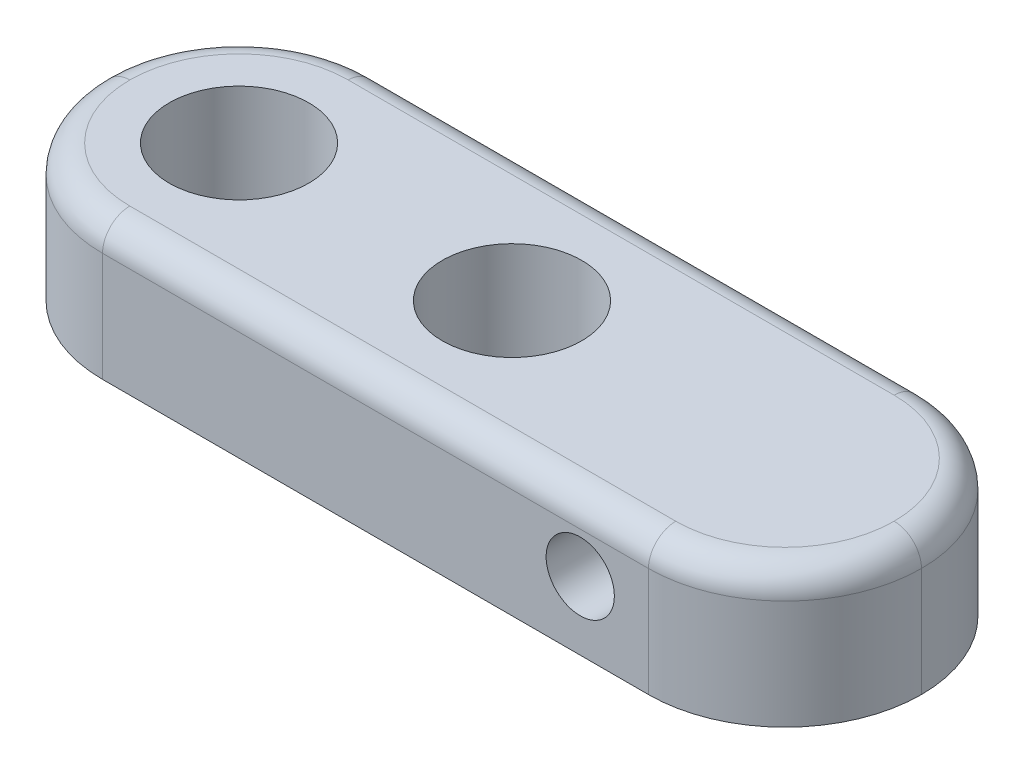
ISO-10303-21;
HEADER;
FILE_DESCRIPTION(('STEP AP214'),'2;1');
FILE_NAME('part.step','',(''),(''),'','','');
FILE_SCHEMA(('AUTOMOTIVE_DESIGN { 1 0 10303 214 1 1 1 1 }'));
ENDSEC;
DATA;
#1=APPLICATION_CONTEXT('core data for automotive mechanical design processes');
#2=APPLICATION_PROTOCOL_DEFINITION('international standard','automotive_design',2000,#1);
#3=PRODUCT_CONTEXT('',#1,'mechanical');
#4=PRODUCT('Part','Part','',(#3));
#5=PRODUCT_RELATED_PRODUCT_CATEGORY('part','',(#4));
#6=PRODUCT_DEFINITION_FORMATION('','',#4);
#7=PRODUCT_DEFINITION_CONTEXT('part definition',#1,'design');
#8=PRODUCT_DEFINITION('design','',#6,#7);
#9=PRODUCT_DEFINITION_SHAPE('','',#8);
#10=(LENGTH_UNIT() NAMED_UNIT(*) SI_UNIT(.MILLI.,.METRE.));
#11=(NAMED_UNIT(*) PLANE_ANGLE_UNIT() SI_UNIT($,.RADIAN.));
#12=(NAMED_UNIT(*) SI_UNIT($,.STERADIAN.) SOLID_ANGLE_UNIT());
#13=UNCERTAINTY_MEASURE_WITH_UNIT(LENGTH_MEASURE(1.E-05),#10,'distance_accuracy_value','');
#14=(GEOMETRIC_REPRESENTATION_CONTEXT(3) GLOBAL_UNCERTAINTY_ASSIGNED_CONTEXT((#13)) GLOBAL_UNIT_ASSIGNED_CONTEXT((#10,
#11,#12)) REPRESENTATION_CONTEXT('',''));
#15=CARTESIAN_POINT('',(0.,0.,0.));
#16=DIRECTION('',(0.,0.,1.));
#17=DIRECTION('',(1.,0.,0.));
#18=AXIS2_PLACEMENT_3D('',#15,#16,#17);
#19=CARTESIAN_POINT('',(-5.,5.,-5.));
#20=DIRECTION('',(0.,0.,1.));
#21=DIRECTION('',(1.,0.,0.));
#22=AXIS2_PLACEMENT_3D('',#19,#20,#21);
#23=PLANE('',#22);
#24=DIRECTION('',(0.,-1.,0.));
#25=VECTOR('',#24,1.);
#26=CARTESIAN_POINT('',(0.,5.,-5.));
#27=LINE('',#26,#25);
#28=CARTESIAN_POINT('',(0.,0.,-5.));
#29=VERTEX_POINT('',#28);
#30=CARTESIAN_POINT('',(0.,4.,-5.));
#31=VERTEX_POINT('',#30);
#32=EDGE_CURVE('E241',#29,#31,#27,.F.);
#33=ORIENTED_EDGE('',*,*,#32,.T.);
#34=DIRECTION('',(-1.,0.,0.));
#35=VECTOR('',#34,1.);
#36=CARTESIAN_POINT('',(20.,4.,-5.));
#37=LINE('',#36,#35);
#38=CARTESIAN_POINT('',(16.1160254037844,4.,-5.));
#39=VERTEX_POINT('',#38);
#40=EDGE_CURVE('E288',#31,#39,#37,.F.);
#41=ORIENTED_EDGE('',*,*,#40,.T.);
#42=DIRECTION('',(-0.5,-0.866025403784439,0.));
#43=VECTOR('',#42,1.);
#44=CARTESIAN_POINT('',(11.2700317547306,-4.39350721331743,-5.));
#45=LINE('',#44,#43);
#46=CARTESIAN_POINT('',(15.25,2.5,-5.));
#47=VERTEX_POINT('',#46);
#48=EDGE_CURVE('E368',#39,#47,#45,.T.);
#49=ORIENTED_EDGE('',*,*,#48,.T.);
#50=DIRECTION('',(0.5,-0.866025403784439,0.));
#51=VECTOR('',#50,1.);
#52=CARTESIAN_POINT('',(9.10496824526946,13.1435072133174,-5.));
#53=LINE('',#52,#51);
#54=CARTESIAN_POINT('',(16.375,0.551442841485011,-5.));
#55=VERTEX_POINT('',#54);
#56=EDGE_CURVE('E373',#47,#55,#53,.T.);
#57=ORIENTED_EDGE('',*,*,#56,.T.);
#58=DIRECTION('',(1.,0.,0.));
#59=VECTOR('',#58,1.);
#60=CARTESIAN_POINT('',(-5.,0.551442841485011,-5.));
#61=LINE('',#60,#59);
#62=CARTESIAN_POINT('',(18.625,0.551442841485013,-5.));
#63=VERTEX_POINT('',#62);
#64=EDGE_CURVE('E378',#55,#63,#61,.T.);
#65=ORIENTED_EDGE('',*,*,#64,.T.);
#66=DIRECTION('',(0.5,0.866025403784439,0.));
#67=VECTOR('',#66,1.);
#68=CARTESIAN_POINT('',(14.6450317547306,-6.34206437183243,-5.));
#69=LINE('',#68,#67);
#70=CARTESIAN_POINT('',(19.75,2.5,-5.));
#71=VERTEX_POINT('',#70);
#72=EDGE_CURVE('E184',#63,#71,#69,.T.);
#73=ORIENTED_EDGE('',*,*,#72,.T.);
#74=DIRECTION('',(-0.500000000000002,0.866025403784438,0.));
#75=VECTOR('',#74,1.);
#76=CARTESIAN_POINT('',(12.4799682452694,15.0920643718324,-5.));
#77=LINE('',#76,#75);
#78=CARTESIAN_POINT('',(18.8839745962156,4.,-5.));
#79=VERTEX_POINT('',#78);
#80=EDGE_CURVE('E374',#71,#79,#77,.T.);
#81=ORIENTED_EDGE('',*,*,#80,.T.);
#82=DIRECTION('',(-1.,0.,0.));
#83=VECTOR('',#82,1.);
#84=CARTESIAN_POINT('',(20.,4.,-5.));
#85=LINE('',#84,#83);
#86=CARTESIAN_POINT('',(20.,4.,-5.));
#87=VERTEX_POINT('',#86);
#88=EDGE_CURVE('E285',#79,#87,#85,.F.);
#89=ORIENTED_EDGE('',*,*,#88,.T.);
#90=DIRECTION('',(0.,-1.,0.));
#91=VECTOR('',#90,1.);
#92=CARTESIAN_POINT('',(20.,5.,-5.));
#93=LINE('',#92,#91);
#94=CARTESIAN_POINT('',(20.,0.,-5.));
#95=VERTEX_POINT('',#94);
#96=EDGE_CURVE('E238',#87,#95,#93,.T.);
#97=ORIENTED_EDGE('',*,*,#96,.T.);
#98=DIRECTION('',(-1.,0.,0.));
#99=VECTOR('',#98,1.);
#100=CARTESIAN_POINT('',(-5.,0.,-5.));
#101=LINE('',#100,#99);
#102=EDGE_CURVE('E221',#95,#29,#101,.T.);
#103=ORIENTED_EDGE('',*,*,#102,.T.);
#104=EDGE_LOOP('',(#33,#41,#49,#57,#65,#73,#81,#89,#97,#103));
#105=FACE_BOUND('',#104,.T.);
#106=ADVANCED_FACE('F45',(#105),#23,.F.);
#107=CARTESIAN_POINT('',(0.,5.,0.));
#108=DIRECTION('',(0.,1.,0.));
#109=DIRECTION('',(0.,0.,1.));
#110=AXIS2_PLACEMENT_3D('',#107,#108,#109);
#111=PLANE('',#110);
#112=CARTESIAN_POINT('',(0.,5.,0.));
#113=DIRECTION('',(0.,1.,0.));
#114=DIRECTION('',(0.,0.,1.));
#115=AXIS2_PLACEMENT_3D('',#112,#113,#114);
#116=CIRCLE('',#115,4.);
#117=CARTESIAN_POINT('',(0.,5.,-4.));
#118=VERTEX_POINT('',#117);
#119=CARTESIAN_POINT('',(-4.,5.,0.));
#120=VERTEX_POINT('',#119);
#121=EDGE_CURVE('E271',#118,#120,#116,.T.);
#122=ORIENTED_EDGE('',*,*,#121,.T.);
#123=CARTESIAN_POINT('',(0.,5.,0.));
#124=DIRECTION('',(0.,1.,0.));
#125=DIRECTION('',(0.,0.,1.));
#126=AXIS2_PLACEMENT_3D('',#123,#124,#125);
#127=CIRCLE('',#126,4.);
#128=CARTESIAN_POINT('',(0.,5.,4.));
#129=VERTEX_POINT('',#128);
#130=EDGE_CURVE('E274',#120,#129,#127,.T.);
#131=ORIENTED_EDGE('',*,*,#130,.T.);
#132=DIRECTION('',(1.,0.,0.));
#133=VECTOR('',#132,1.);
#134=CARTESIAN_POINT('',(20.,5.,4.));
#135=LINE('',#134,#133);
#136=CARTESIAN_POINT('',(20.,5.,4.));
#137=VERTEX_POINT('',#136);
#138=EDGE_CURVE('E251',#129,#137,#135,.T.);
#139=ORIENTED_EDGE('',*,*,#138,.T.);
#140=CARTESIAN_POINT('',(20.,5.,0.));
#141=DIRECTION('',(0.,1.,0.));
#142=DIRECTION('',(0.,0.,1.));
#143=AXIS2_PLACEMENT_3D('',#140,#141,#142);
#144=CIRCLE('',#143,4.);
#145=CARTESIAN_POINT('',(24.,5.,0.));
#146=VERTEX_POINT('',#145);
#147=EDGE_CURVE('E262',#137,#146,#144,.T.);
#148=ORIENTED_EDGE('',*,*,#147,.T.);
#149=CARTESIAN_POINT('',(20.,5.,0.));
#150=DIRECTION('',(0.,1.,0.));
#151=DIRECTION('',(0.,0.,1.));
#152=AXIS2_PLACEMENT_3D('',#149,#150,#151);
#153=CIRCLE('',#152,4.);
#154=CARTESIAN_POINT('',(20.,5.,-4.));
#155=VERTEX_POINT('',#154);
#156=EDGE_CURVE('E265',#146,#155,#153,.T.);
#157=ORIENTED_EDGE('',*,*,#156,.T.);
#158=DIRECTION('',(-1.,0.,0.));
#159=VECTOR('',#158,1.);
#160=CARTESIAN_POINT('',(0.,5.,-4.));
#161=LINE('',#160,#159);
#162=EDGE_CURVE('E268',#155,#118,#161,.T.);
#163=ORIENTED_EDGE('',*,*,#162,.T.);
#164=EDGE_LOOP('',(#122,#131,#139,#148,#157,#163));
#165=FACE_BOUND('',#164,.T.);
#166=CARTESIAN_POINT('',(0.,5.,0.));
#167=DIRECTION('',(0.,1.,0.));
#168=DIRECTION('',(0.,0.,1.));
#169=AXIS2_PLACEMENT_3D('',#166,#167,#168);
#170=CIRCLE('',#169,2.555);
#171=CARTESIAN_POINT('',(0.,5.,2.555));
#172=VERTEX_POINT('',#171);
#173=EDGE_CURVE('E210',#172,#172,#170,.T.);
#174=ORIENTED_EDGE('',*,*,#173,.F.);
#175=EDGE_LOOP('',(#174));
#176=FACE_BOUND('',#175,.T.);
#177=CARTESIAN_POINT('',(10.,5.,0.));
#178=DIRECTION('',(0.,1.,0.));
#179=DIRECTION('',(0.,0.,1.));
#180=AXIS2_PLACEMENT_3D('',#177,#178,#179);
#181=CIRCLE('',#180,2.555);
#182=CARTESIAN_POINT('',(10.,5.,2.555));
#183=VERTEX_POINT('',#182);
#184=EDGE_CURVE('E202',#183,#183,#181,.T.);
#185=ORIENTED_EDGE('',*,*,#184,.F.);
#186=EDGE_LOOP('',(#185));
#187=FACE_BOUND('',#186,.T.);
#188=ADVANCED_FACE('F432',(#165,#176,#187),#111,.T.);
#189=CARTESIAN_POINT('',(0.,0.,0.));
#190=DIRECTION('',(0.,1.,0.));
#191=DIRECTION('',(0.,0.,1.));
#192=AXIS2_PLACEMENT_3D('',#189,#190,#191);
#193=PLANE('',#192);
#194=CARTESIAN_POINT('',(0.,0.,0.));
#195=DIRECTION('',(0.,1.,0.));
#196=DIRECTION('',(0.,0.,1.));
#197=AXIS2_PLACEMENT_3D('',#194,#195,#196);
#198=CIRCLE('',#197,5.);
#199=CARTESIAN_POINT('',(0.,0.,5.));
#200=VERTEX_POINT('',#199);
#201=CARTESIAN_POINT('',(-5.,0.,0.));
#202=VERTEX_POINT('',#201);
#203=EDGE_CURVE('E232',#200,#202,#198,.F.);
#204=ORIENTED_EDGE('',*,*,#203,.T.);
#205=CARTESIAN_POINT('',(0.,0.,0.));
#206=DIRECTION('',(0.,1.,0.));
#207=DIRECTION('',(0.,0.,1.));
#208=AXIS2_PLACEMENT_3D('',#205,#206,#207);
#209=CIRCLE('',#208,5.);
#210=EDGE_CURVE('E235',#202,#29,#209,.F.);
#211=ORIENTED_EDGE('',*,*,#210,.T.);
#212=ORIENTED_EDGE('',*,*,#102,.F.);
#213=CARTESIAN_POINT('',(20.,0.,0.));
#214=DIRECTION('',(0.,1.,0.));
#215=DIRECTION('',(0.,0.,1.));
#216=AXIS2_PLACEMENT_3D('',#213,#214,#215);
#217=CIRCLE('',#216,5.);
#218=CARTESIAN_POINT('',(25.,0.,0.));
#219=VERTEX_POINT('',#218);
#220=EDGE_CURVE('E228',#95,#219,#217,.F.);
#221=ORIENTED_EDGE('',*,*,#220,.T.);
#222=CARTESIAN_POINT('',(20.,0.,0.));
#223=DIRECTION('',(0.,1.,0.));
#224=DIRECTION('',(0.,0.,1.));
#225=AXIS2_PLACEMENT_3D('',#222,#223,#224);
#226=CIRCLE('',#225,5.);
#227=CARTESIAN_POINT('',(20.,0.,5.));
#228=VERTEX_POINT('',#227);
#229=EDGE_CURVE('E225',#219,#228,#226,.F.);
#230=ORIENTED_EDGE('',*,*,#229,.T.);
#231=DIRECTION('',(1.,0.,0.));
#232=VECTOR('',#231,1.);
#233=CARTESIAN_POINT('',(-5.,0.,5.));
#234=LINE('',#233,#232);
#235=EDGE_CURVE('E214',#200,#228,#234,.T.);
#236=ORIENTED_EDGE('',*,*,#235,.F.);
#237=EDGE_LOOP('',(#204,#211,#212,#221,#230,#236));
#238=FACE_BOUND('',#237,.T.);
#239=CARTESIAN_POINT('',(0.,0.,0.));
#240=DIRECTION('',(0.,1.,0.));
#241=DIRECTION('',(0.,0.,1.));
#242=AXIS2_PLACEMENT_3D('',#239,#240,#241);
#243=CIRCLE('',#242,2.555);
#244=CARTESIAN_POINT('',(0.,0.,2.555));
#245=VERTEX_POINT('',#244);
#246=EDGE_CURVE('E206',#245,#245,#243,.T.);
#247=ORIENTED_EDGE('',*,*,#246,.T.);
#248=EDGE_LOOP('',(#247));
#249=FACE_BOUND('',#248,.T.);
#250=CARTESIAN_POINT('',(10.,0.,0.));
#251=DIRECTION('',(0.,1.,0.));
#252=DIRECTION('',(0.,0.,1.));
#253=AXIS2_PLACEMENT_3D('',#250,#251,#252);
#254=CIRCLE('',#253,2.555);
#255=CARTESIAN_POINT('',(10.,0.,2.555));
#256=VERTEX_POINT('',#255);
#257=EDGE_CURVE('E196',#256,#256,#254,.T.);
#258=ORIENTED_EDGE('',*,*,#257,.T.);
#259=EDGE_LOOP('',(#258));
#260=FACE_BOUND('',#259,.T.);
#261=ADVANCED_FACE('F422',(#238,#249,#260),#193,.F.);
#262=CARTESIAN_POINT('',(-5.,5.,5.));
#263=DIRECTION('',(0.,0.,-1.));
#264=DIRECTION('',(-1.,0.,0.));
#265=AXIS2_PLACEMENT_3D('',#262,#263,#264);
#266=PLANE('',#265);
#267=CARTESIAN_POINT('',(17.5,2.5,5.));
#268=DIRECTION('',(0.,0.,1.));
#269=DIRECTION('',(1.,0.,0.));
#270=AXIS2_PLACEMENT_3D('',#267,#268,#269);
#271=CIRCLE('',#270,1.25);
#272=CARTESIAN_POINT('',(18.75,2.5,5.));
#273=VERTEX_POINT('',#272);
#274=EDGE_CURVE('E190',#273,#273,#271,.T.);
#275=ORIENTED_EDGE('',*,*,#274,.F.);
#276=EDGE_LOOP('',(#275));
#277=FACE_BOUND('',#276,.T.);
#278=DIRECTION('',(0.,-1.,0.));
#279=VECTOR('',#278,1.);
#280=CARTESIAN_POINT('',(20.,5.,5.));
#281=LINE('',#280,#279);
#282=CARTESIAN_POINT('',(20.,4.,5.));
#283=VERTEX_POINT('',#282);
#284=EDGE_CURVE('E245',#228,#283,#281,.F.);
#285=ORIENTED_EDGE('',*,*,#284,.T.);
#286=DIRECTION('',(1.,0.,0.));
#287=VECTOR('',#286,1.);
#288=CARTESIAN_POINT('',(0.,4.,5.));
#289=LINE('',#288,#287);
#290=CARTESIAN_POINT('',(0.,4.,5.));
#291=VERTEX_POINT('',#290);
#292=EDGE_CURVE('E11',#283,#291,#289,.F.);
#293=ORIENTED_EDGE('',*,*,#292,.T.);
#294=DIRECTION('',(0.,-1.,0.));
#295=VECTOR('',#294,1.);
#296=CARTESIAN_POINT('',(0.,5.,5.));
#297=LINE('',#296,#295);
#298=EDGE_CURVE('E248',#291,#200,#297,.T.);
#299=ORIENTED_EDGE('',*,*,#298,.T.);
#300=ORIENTED_EDGE('',*,*,#235,.T.);
#301=EDGE_LOOP('',(#285,#293,#299,#300));
#302=FACE_BOUND('',#301,.T.);
#303=ADVANCED_FACE('F342',(#277,#302),#266,.F.);
#304=CARTESIAN_POINT('',(0.,5.,0.));
#305=DIRECTION('',(0.,-1.,0.));
#306=DIRECTION('',(0.,0.,-1.));
#307=AXIS2_PLACEMENT_3D('',#304,#305,#306);
#308=CYLINDRICAL_SURFACE('',#307,2.555);
#309=ORIENTED_EDGE('',*,*,#173,.T.);
#310=EDGE_LOOP('',(#309));
#311=FACE_BOUND('',#310,.T.);
#312=ORIENTED_EDGE('',*,*,#246,.F.);
#313=EDGE_LOOP('',(#312));
#314=FACE_BOUND('',#313,.T.);
#315=ADVANCED_FACE('F421',(#311,#314),#308,.F.);
#316=CARTESIAN_POINT('',(10.,5.,0.));
#317=DIRECTION('',(0.,-1.,0.));
#318=DIRECTION('',(0.,0.,-1.));
#319=AXIS2_PLACEMENT_3D('',#316,#317,#318);
#320=CYLINDRICAL_SURFACE('',#319,2.555);
#321=ORIENTED_EDGE('',*,*,#184,.T.);
#322=EDGE_LOOP('',(#321));
#323=FACE_BOUND('',#322,.T.);
#324=ORIENTED_EDGE('',*,*,#257,.F.);
#325=EDGE_LOOP('',(#324));
#326=FACE_BOUND('',#325,.T.);
#327=ADVANCED_FACE('F416',(#323,#326),#320,.F.);
#328=CARTESIAN_POINT('',(17.5,2.5,-5.));
#329=DIRECTION('',(0.,0.,1.));
#330=DIRECTION('',(1.,0.,0.));
#331=AXIS2_PLACEMENT_3D('',#328,#329,#330);
#332=CYLINDRICAL_SURFACE('',#331,1.25);
#333=CARTESIAN_POINT('',(17.5,2.5,0.));
#334=DIRECTION('',(0.,0.,1.));
#335=DIRECTION('',(1.,0.,0.));
#336=AXIS2_PLACEMENT_3D('',#333,#334,#335);
#337=CIRCLE('',#336,1.25);
#338=CARTESIAN_POINT('',(18.75,2.5,0.));
#339=VERTEX_POINT('',#338);
#340=EDGE_CURVE('E256',#339,#339,#337,.T.);
#341=ORIENTED_EDGE('',*,*,#340,.F.);
#342=EDGE_LOOP('',(#341));
#343=FACE_BOUND('',#342,.T.);
#344=ORIENTED_EDGE('',*,*,#274,.T.);
#345=EDGE_LOOP('',(#344));
#346=FACE_BOUND('',#345,.T.);
#347=ADVANCED_FACE('F413',(#343,#346),#332,.F.);
#348=CARTESIAN_POINT('',(0.,0.,0.));
#349=DIRECTION('',(0.,0.,1.));
#350=DIRECTION('',(1.,0.,0.));
#351=AXIS2_PLACEMENT_3D('',#348,#349,#350);
#352=PLANE('',#351);
#353=DIRECTION('',(-0.500000000000002,0.866025403784438,0.));
#354=VECTOR('',#353,1.);
#355=CARTESIAN_POINT('',(12.4799682452694,15.0920643718324,0.));
#356=LINE('',#355,#354);
#357=CARTESIAN_POINT('',(19.75,2.5,0.));
#358=VERTEX_POINT('',#357);
#359=CARTESIAN_POINT('',(18.625,4.44855715851499,0.));
#360=VERTEX_POINT('',#359);
#361=EDGE_CURVE('E166',#358,#360,#356,.T.);
#362=ORIENTED_EDGE('',*,*,#361,.F.);
#363=DIRECTION('',(0.5,0.866025403784439,0.));
#364=VECTOR('',#363,1.);
#365=CARTESIAN_POINT('',(14.6450317547306,-6.34206437183243,0.));
#366=LINE('',#365,#364);
#367=CARTESIAN_POINT('',(18.625,0.551442841485013,0.));
#368=VERTEX_POINT('',#367);
#369=EDGE_CURVE('E393',#368,#358,#366,.T.);
#370=ORIENTED_EDGE('',*,*,#369,.F.);
#371=DIRECTION('',(1.,0.,0.));
#372=VECTOR('',#371,1.);
#373=CARTESIAN_POINT('',(-5.,0.551442841485011,0.));
#374=LINE('',#373,#372);
#375=CARTESIAN_POINT('',(16.375,0.551442841485011,0.));
#376=VERTEX_POINT('',#375);
#377=EDGE_CURVE('E401',#376,#368,#374,.T.);
#378=ORIENTED_EDGE('',*,*,#377,.F.);
#379=DIRECTION('',(0.5,-0.866025403784439,0.));
#380=VECTOR('',#379,1.);
#381=CARTESIAN_POINT('',(9.10496824526946,13.1435072133174,0.));
#382=LINE('',#381,#380);
#383=CARTESIAN_POINT('',(15.25,2.5,0.));
#384=VERTEX_POINT('',#383);
#385=EDGE_CURVE('E403',#384,#376,#382,.T.);
#386=ORIENTED_EDGE('',*,*,#385,.F.);
#387=DIRECTION('',(-0.5,-0.866025403784439,0.));
#388=VECTOR('',#387,1.);
#389=CARTESIAN_POINT('',(11.2700317547306,-4.39350721331743,0.));
#390=LINE('',#389,#388);
#391=CARTESIAN_POINT('',(16.375,4.44855715851499,0.));
#392=VERTEX_POINT('',#391);
#393=EDGE_CURVE('E168',#392,#384,#390,.T.);
#394=ORIENTED_EDGE('',*,*,#393,.F.);
#395=DIRECTION('',(-1.,0.,0.));
#396=VECTOR('',#395,1.);
#397=CARTESIAN_POINT('',(-5.,4.44855715851499,0.));
#398=LINE('',#397,#396);
#399=EDGE_CURVE('E161',#360,#392,#398,.T.);
#400=ORIENTED_EDGE('',*,*,#399,.F.);
#401=EDGE_LOOP('',(#362,#370,#378,#386,#394,#400));
#402=FACE_BOUND('',#401,.T.);
#403=ORIENTED_EDGE('',*,*,#340,.T.);
#404=EDGE_LOOP('',(#403));
#405=FACE_BOUND('',#404,.T.);
#406=ADVANCED_FACE('F163',(#402,#405),#352,.F.);
#407=CARTESIAN_POINT('',(12.4799682452694,15.0920643718324,0.));
#408=DIRECTION('',(-0.866025403784438,-0.500000000000002,0.));
#409=DIRECTION('',(0.500000000000002,-0.866025403784438,0.));
#410=AXIS2_PLACEMENT_3D('',#407,#408,#409);
#411=PLANE('',#410);
#412=DIRECTION('',(0.,0.,-1.));
#413=VECTOR('',#412,1.);
#414=CARTESIAN_POINT('',(18.625,4.44855715851499,0.));
#415=LINE('',#414,#413);
#416=CARTESIAN_POINT('',(18.625,4.44855715851499,-4.8937541471484));
#417=VERTEX_POINT('',#416);
#418=EDGE_CURVE('E179',#360,#417,#415,.T.);
#419=ORIENTED_EDGE('',*,*,#418,.T.);
#420=CARTESIAN_POINT('',(18.8839745962156,4.,-4.));
#421=DIRECTION('',(-0.866025403784438,-0.500000000000002,0.));
#422=DIRECTION('',(0.500000000000002,-0.866025403784438,0.));
#423=AXIS2_PLACEMENT_3D('',#420,#421,#422);
#424=ELLIPSE('',#423,1.15470053837925,1.);
#425=EDGE_CURVE('E296',#417,#79,#424,.T.);
#426=ORIENTED_EDGE('',*,*,#425,.T.);
#427=ORIENTED_EDGE('',*,*,#80,.F.);
#428=DIRECTION('',(0.,0.,-1.));
#429=VECTOR('',#428,1.);
#430=CARTESIAN_POINT('',(19.75,2.5,0.));
#431=LINE('',#430,#429);
#432=EDGE_CURVE('E182',#358,#71,#431,.T.);
#433=ORIENTED_EDGE('',*,*,#432,.F.);
#434=ORIENTED_EDGE('',*,*,#361,.T.);
#435=EDGE_LOOP('',(#419,#426,#427,#433,#434));
#436=FACE_BOUND('',#435,.T.);
#437=ADVANCED_FACE('F178',(#436),#411,.T.);
#438=CARTESIAN_POINT('',(-5.,4.44855715851499,0.));
#439=DIRECTION('',(0.,-1.,0.));
#440=DIRECTION('',(0.,0.,-1.));
#441=AXIS2_PLACEMENT_3D('',#438,#439,#440);
#442=PLANE('',#441);
#443=DIRECTION('',(0.,0.,-1.));
#444=VECTOR('',#443,1.);
#445=CARTESIAN_POINT('',(16.375,4.44855715851499,0.));
#446=LINE('',#445,#444);
#447=CARTESIAN_POINT('',(16.375,4.44855715851499,-4.8937541471484));
#448=VERTEX_POINT('',#447);
#449=EDGE_CURVE('E191',#392,#448,#446,.T.);
#450=ORIENTED_EDGE('',*,*,#449,.T.);
#451=DIRECTION('',(1.,0.,0.));
#452=VECTOR('',#451,1.);
#453=CARTESIAN_POINT('',(16.375,4.44855715851499,-4.8937541471484));
#454=LINE('',#453,#452);
#455=EDGE_CURVE('E188',#448,#417,#454,.T.);
#456=ORIENTED_EDGE('',*,*,#455,.T.);
#457=ORIENTED_EDGE('',*,*,#418,.F.);
#458=ORIENTED_EDGE('',*,*,#399,.T.);
#459=EDGE_LOOP('',(#450,#456,#457,#458));
#460=FACE_BOUND('',#459,.T.);
#461=ADVANCED_FACE('F186',(#460),#442,.T.);
#462=CARTESIAN_POINT('',(11.2700317547306,-4.39350721331743,0.));
#463=DIRECTION('',(0.866025403784439,-0.5,0.));
#464=DIRECTION('',(0.5,0.866025403784439,0.));
#465=AXIS2_PLACEMENT_3D('',#462,#463,#464);
#466=PLANE('',#465);
#467=ORIENTED_EDGE('',*,*,#48,.F.);
#468=CARTESIAN_POINT('',(16.1160254037844,4.,-4.));
#469=DIRECTION('',(0.866025403784439,-0.5,0.));
#470=DIRECTION('',(0.5,0.866025403784439,0.));
#471=AXIS2_PLACEMENT_3D('',#468,#469,#470);
#472=ELLIPSE('',#471,1.15470053837925,1.);
#473=EDGE_CURVE('E291',#39,#448,#472,.T.);
#474=ORIENTED_EDGE('',*,*,#473,.T.);
#475=ORIENTED_EDGE('',*,*,#449,.F.);
#476=ORIENTED_EDGE('',*,*,#393,.T.);
#477=DIRECTION('',(0.,0.,-1.));
#478=VECTOR('',#477,1.);
#479=CARTESIAN_POINT('',(15.25,2.5,0.));
#480=LINE('',#479,#478);
#481=EDGE_CURVE('E198',#384,#47,#480,.T.);
#482=ORIENTED_EDGE('',*,*,#481,.T.);
#483=EDGE_LOOP('',(#467,#474,#475,#476,#482));
#484=FACE_BOUND('',#483,.T.);
#485=ADVANCED_FACE('F366',(#484),#466,.T.);
#486=CARTESIAN_POINT('',(9.10496824526946,13.1435072133174,0.));
#487=DIRECTION('',(0.866025403784439,0.5,0.));
#488=DIRECTION('',(-0.5,0.866025403784439,0.));
#489=AXIS2_PLACEMENT_3D('',#486,#487,#488);
#490=PLANE('',#489);
#491=ORIENTED_EDGE('',*,*,#56,.F.);
#492=ORIENTED_EDGE('',*,*,#481,.F.);
#493=ORIENTED_EDGE('',*,*,#385,.T.);
#494=DIRECTION('',(0.,0.,-1.));
#495=VECTOR('',#494,1.);
#496=CARTESIAN_POINT('',(16.375,0.551442841485011,0.));
#497=LINE('',#496,#495);
#498=EDGE_CURVE('E396',#376,#55,#497,.T.);
#499=ORIENTED_EDGE('',*,*,#498,.T.);
#500=EDGE_LOOP('',(#491,#492,#493,#499));
#501=FACE_BOUND('',#500,.T.);
#502=ADVANCED_FACE('F451',(#501),#490,.T.);
#503=CARTESIAN_POINT('',(-5.,0.551442841485011,0.));
#504=DIRECTION('',(0.,1.,0.));
#505=DIRECTION('',(0.,0.,1.));
#506=AXIS2_PLACEMENT_3D('',#503,#504,#505);
#507=PLANE('',#506);
#508=ORIENTED_EDGE('',*,*,#64,.F.);
#509=ORIENTED_EDGE('',*,*,#498,.F.);
#510=ORIENTED_EDGE('',*,*,#377,.T.);
#511=DIRECTION('',(0.,0.,-1.));
#512=VECTOR('',#511,1.);
#513=CARTESIAN_POINT('',(18.625,0.551442841485013,0.));
#514=LINE('',#513,#512);
#515=EDGE_CURVE('E392',#368,#63,#514,.T.);
#516=ORIENTED_EDGE('',*,*,#515,.T.);
#517=EDGE_LOOP('',(#508,#509,#510,#516));
#518=FACE_BOUND('',#517,.T.);
#519=ADVANCED_FACE('F454',(#518),#507,.T.);
#520=CARTESIAN_POINT('',(14.6450317547306,-6.34206437183243,0.));
#521=DIRECTION('',(-0.866025403784439,0.5,0.));
#522=DIRECTION('',(-0.5,-0.866025403784439,0.));
#523=AXIS2_PLACEMENT_3D('',#520,#521,#522);
#524=PLANE('',#523);
#525=ORIENTED_EDGE('',*,*,#72,.F.);
#526=ORIENTED_EDGE('',*,*,#515,.F.);
#527=ORIENTED_EDGE('',*,*,#369,.T.);
#528=ORIENTED_EDGE('',*,*,#432,.T.);
#529=EDGE_LOOP('',(#525,#526,#527,#528));
#530=FACE_BOUND('',#529,.T.);
#531=ADVANCED_FACE('F458',(#530),#524,.T.);
#532=CARTESIAN_POINT('',(0.,5.,0.));
#533=DIRECTION('',(0.,-1.,0.));
#534=DIRECTION('',(0.,0.,-1.));
#535=AXIS2_PLACEMENT_3D('',#532,#533,#534);
#536=CYLINDRICAL_SURFACE('',#535,5.);
#537=ORIENTED_EDGE('',*,*,#298,.F.);
#538=CARTESIAN_POINT('',(0.,4.,0.));
#539=DIRECTION('',(0.,1.,0.));
#540=DIRECTION('',(0.,0.,1.));
#541=AXIS2_PLACEMENT_3D('',#538,#539,#540);
#542=CIRCLE('',#541,5.);
#543=CARTESIAN_POINT('',(-5.,4.,0.));
#544=VERTEX_POINT('',#543);
#545=EDGE_CURVE('E278',#291,#544,#542,.F.);
#546=ORIENTED_EDGE('',*,*,#545,.T.);
#547=DIRECTION('',(0.,-1.,0.));
#548=VECTOR('',#547,1.);
#549=CARTESIAN_POINT('',(-5.,5.,0.));
#550=LINE('',#549,#548);
#551=EDGE_CURVE('E252',#202,#544,#550,.F.);
#552=ORIENTED_EDGE('',*,*,#551,.F.);
#553=ORIENTED_EDGE('',*,*,#203,.F.);
#554=EDGE_LOOP('',(#537,#546,#552,#553));
#555=FACE_BOUND('',#554,.T.);
#556=ADVANCED_FACE('F347',(#555),#536,.T.);
#557=CARTESIAN_POINT('',(0.,5.,0.));
#558=DIRECTION('',(0.,-1.,0.));
#559=DIRECTION('',(0.,0.,-1.));
#560=AXIS2_PLACEMENT_3D('',#557,#558,#559);
#561=CYLINDRICAL_SURFACE('',#560,5.);
#562=ORIENTED_EDGE('',*,*,#551,.T.);
#563=CARTESIAN_POINT('',(0.,4.,0.));
#564=DIRECTION('',(0.,1.,0.));
#565=DIRECTION('',(0.,0.,1.));
#566=AXIS2_PLACEMENT_3D('',#563,#564,#565);
#567=CIRCLE('',#566,5.);
#568=EDGE_CURVE('E282',#544,#31,#567,.F.);
#569=ORIENTED_EDGE('',*,*,#568,.T.);
#570=ORIENTED_EDGE('',*,*,#32,.F.);
#571=ORIENTED_EDGE('',*,*,#210,.F.);
#572=EDGE_LOOP('',(#562,#569,#570,#571));
#573=FACE_BOUND('',#572,.T.);
#574=ADVANCED_FACE('F359',(#573),#561,.T.);
#575=CARTESIAN_POINT('',(20.,5.,0.));
#576=DIRECTION('',(0.,-1.,0.));
#577=DIRECTION('',(0.,0.,-1.));
#578=AXIS2_PLACEMENT_3D('',#575,#576,#577);
#579=CYLINDRICAL_SURFACE('',#578,5.);
#580=DIRECTION('',(0.,-1.,0.));
#581=VECTOR('',#580,1.);
#582=CARTESIAN_POINT('',(25.,5.,0.));
#583=LINE('',#582,#581);
#584=CARTESIAN_POINT('',(25.,4.,0.));
#585=VERTEX_POINT('',#584);
#586=EDGE_CURVE('E257',#585,#219,#583,.T.);
#587=ORIENTED_EDGE('',*,*,#586,.F.);
#588=CARTESIAN_POINT('',(20.,4.,0.));
#589=DIRECTION('',(0.,1.,0.));
#590=DIRECTION('',(0.,0.,1.));
#591=AXIS2_PLACEMENT_3D('',#588,#589,#590);
#592=CIRCLE('',#591,5.);
#593=EDGE_CURVE('E55',#585,#283,#592,.F.);
#594=ORIENTED_EDGE('',*,*,#593,.T.);
#595=ORIENTED_EDGE('',*,*,#284,.F.);
#596=ORIENTED_EDGE('',*,*,#229,.F.);
#597=EDGE_LOOP('',(#587,#594,#595,#596));
#598=FACE_BOUND('',#597,.T.);
#599=ADVANCED_FACE('F551',(#598),#579,.T.);
#600=CARTESIAN_POINT('',(20.,5.,0.));
#601=DIRECTION('',(0.,-1.,0.));
#602=DIRECTION('',(0.,0.,-1.));
#603=AXIS2_PLACEMENT_3D('',#600,#601,#602);
#604=CYLINDRICAL_SURFACE('',#603,5.);
#605=ORIENTED_EDGE('',*,*,#96,.F.);
#606=CARTESIAN_POINT('',(20.,4.,0.));
#607=DIRECTION('',(0.,1.,0.));
#608=DIRECTION('',(0.,0.,1.));
#609=AXIS2_PLACEMENT_3D('',#606,#607,#608);
#610=CIRCLE('',#609,5.);
#611=EDGE_CURVE('E70',#87,#585,#610,.F.);
#612=ORIENTED_EDGE('',*,*,#611,.T.);
#613=ORIENTED_EDGE('',*,*,#586,.T.);
#614=ORIENTED_EDGE('',*,*,#220,.F.);
#615=EDGE_LOOP('',(#605,#612,#613,#614));
#616=FACE_BOUND('',#615,.T.);
#617=ADVANCED_FACE('F558',(#616),#604,.T.);
#618=CARTESIAN_POINT('',(20.,4.,0.));
#619=DIRECTION('',(0.,1.,0.));
#620=DIRECTION('',(0.,0.,1.));
#621=AXIS2_PLACEMENT_3D('',#618,#619,#620);
#622=TOROIDAL_SURFACE('',#621,4.,1.);
#623=CARTESIAN_POINT('',(24.,4.,0.));
#624=DIRECTION('',(0.,0.,1.));
#625=DIRECTION('',(1.,0.,0.));
#626=AXIS2_PLACEMENT_3D('',#623,#624,#625);
#627=CIRCLE('',#626,1.);
#628=EDGE_CURVE('E316',#585,#146,#627,.T.);
#629=ORIENTED_EDGE('',*,*,#628,.F.);
#630=ORIENTED_EDGE('',*,*,#611,.F.);
#631=CARTESIAN_POINT('',(20.,4.,-4.));
#632=DIRECTION('',(-1.,0.,0.));
#633=DIRECTION('',(0.,0.,1.));
#634=AXIS2_PLACEMENT_3D('',#631,#632,#633);
#635=CIRCLE('',#634,1.);
#636=EDGE_CURVE('E49',#155,#87,#635,.T.);
#637=ORIENTED_EDGE('',*,*,#636,.F.);
#638=ORIENTED_EDGE('',*,*,#156,.F.);
#639=EDGE_LOOP('',(#629,#630,#637,#638));
#640=FACE_BOUND('',#639,.T.);
#641=ADVANCED_FACE('F47',(#640),#622,.T.);
#642=CARTESIAN_POINT('',(0.,4.,-4.));
#643=DIRECTION('',(1.,0.,0.));
#644=DIRECTION('',(0.,0.,-1.));
#645=AXIS2_PLACEMENT_3D('',#642,#643,#644);
#646=CYLINDRICAL_SURFACE('',#645,1.);
#647=ORIENTED_EDGE('',*,*,#473,.F.);
#648=ORIENTED_EDGE('',*,*,#40,.F.);
#649=CARTESIAN_POINT('',(0.,4.,-4.));
#650=DIRECTION('',(-1.,0.,0.));
#651=DIRECTION('',(0.,0.,1.));
#652=AXIS2_PLACEMENT_3D('',#649,#650,#651);
#653=CIRCLE('',#652,1.);
#654=EDGE_CURVE('E313',#118,#31,#653,.T.);
#655=ORIENTED_EDGE('',*,*,#654,.F.);
#656=ORIENTED_EDGE('',*,*,#162,.F.);
#657=ORIENTED_EDGE('',*,*,#636,.T.);
#658=ORIENTED_EDGE('',*,*,#88,.F.);
#659=ORIENTED_EDGE('',*,*,#425,.F.);
#660=ORIENTED_EDGE('',*,*,#455,.F.);
#661=EDGE_LOOP('',(#647,#648,#655,#656,#657,#658,#659,#660));
#662=FACE_BOUND('',#661,.T.);
#663=ADVANCED_FACE('F329',(#662),#646,.T.);
#664=CARTESIAN_POINT('',(20.,4.,0.));
#665=DIRECTION('',(0.,1.,0.));
#666=DIRECTION('',(0.,0.,1.));
#667=AXIS2_PLACEMENT_3D('',#664,#665,#666);
#668=TOROIDAL_SURFACE('',#667,4.,1.);
#669=ORIENTED_EDGE('',*,*,#628,.T.);
#670=ORIENTED_EDGE('',*,*,#147,.F.);
#671=CARTESIAN_POINT('',(20.,4.,4.));
#672=DIRECTION('',(-1.,0.,0.));
#673=DIRECTION('',(0.,0.,1.));
#674=AXIS2_PLACEMENT_3D('',#671,#672,#673);
#675=CIRCLE('',#674,1.);
#676=EDGE_CURVE('E309',#283,#137,#675,.T.);
#677=ORIENTED_EDGE('',*,*,#676,.F.);
#678=ORIENTED_EDGE('',*,*,#593,.F.);
#679=EDGE_LOOP('',(#669,#670,#677,#678));
#680=FACE_BOUND('',#679,.T.);
#681=ADVANCED_FACE('F334',(#680),#668,.T.);
#682=CARTESIAN_POINT('',(0.,4.,0.));
#683=DIRECTION('',(0.,1.,0.));
#684=DIRECTION('',(0.,0.,1.));
#685=AXIS2_PLACEMENT_3D('',#682,#683,#684);
#686=TOROIDAL_SURFACE('',#685,4.,1.);
#687=ORIENTED_EDGE('',*,*,#654,.T.);
#688=ORIENTED_EDGE('',*,*,#568,.F.);
#689=CARTESIAN_POINT('',(-4.,4.,0.));
#690=DIRECTION('',(0.,0.,1.));
#691=DIRECTION('',(1.,0.,0.));
#692=AXIS2_PLACEMENT_3D('',#689,#690,#691);
#693=CIRCLE('',#692,1.);
#694=EDGE_CURVE('E306',#120,#544,#693,.T.);
#695=ORIENTED_EDGE('',*,*,#694,.F.);
#696=ORIENTED_EDGE('',*,*,#121,.F.);
#697=EDGE_LOOP('',(#687,#688,#695,#696));
#698=FACE_BOUND('',#697,.T.);
#699=ADVANCED_FACE('F356',(#698),#686,.T.);
#700=CARTESIAN_POINT('',(0.,4.,4.));
#701=DIRECTION('',(-1.,0.,0.));
#702=DIRECTION('',(0.,0.,1.));
#703=AXIS2_PLACEMENT_3D('',#700,#701,#702);
#704=CYLINDRICAL_SURFACE('',#703,1.);
#705=ORIENTED_EDGE('',*,*,#676,.T.);
#706=ORIENTED_EDGE('',*,*,#138,.F.);
#707=CARTESIAN_POINT('',(0.,4.,4.));
#708=DIRECTION('',(-1.,0.,0.));
#709=DIRECTION('',(0.,0.,1.));
#710=AXIS2_PLACEMENT_3D('',#707,#708,#709);
#711=CIRCLE('',#710,1.);
#712=EDGE_CURVE('E303',#291,#129,#711,.T.);
#713=ORIENTED_EDGE('',*,*,#712,.F.);
#714=ORIENTED_EDGE('',*,*,#292,.F.);
#715=EDGE_LOOP('',(#705,#706,#713,#714));
#716=FACE_BOUND('',#715,.T.);
#717=ADVANCED_FACE('F339',(#716),#704,.T.);
#718=CARTESIAN_POINT('',(0.,4.,0.));
#719=DIRECTION('',(0.,1.,0.));
#720=DIRECTION('',(0.,0.,1.));
#721=AXIS2_PLACEMENT_3D('',#718,#719,#720);
#722=TOROIDAL_SURFACE('',#721,4.,1.);
#723=ORIENTED_EDGE('',*,*,#694,.T.);
#724=ORIENTED_EDGE('',*,*,#545,.F.);
#725=ORIENTED_EDGE('',*,*,#712,.T.);
#726=ORIENTED_EDGE('',*,*,#130,.F.);
#727=EDGE_LOOP('',(#723,#724,#725,#726));
#728=FACE_BOUND('',#727,.T.);
#729=ADVANCED_FACE('F350',(#728),#722,.T.);
#730=CLOSED_SHELL('',(#106,#188,#261,#303,#315,#327,#347,#406,#437,#461,#485,#502,#519,#531,
#556,#574,#599,#617,#641,#663,#681,#699,#717,#729));
#731=MANIFOLD_SOLID_BREP('B2',#730);
#732=ADVANCED_BREP_SHAPE_REPRESENTATION('',(#18,#731),#14);
#733=SHAPE_DEFINITION_REPRESENTATION(#9,#732);
ENDSEC;
END-ISO-10303-21;
